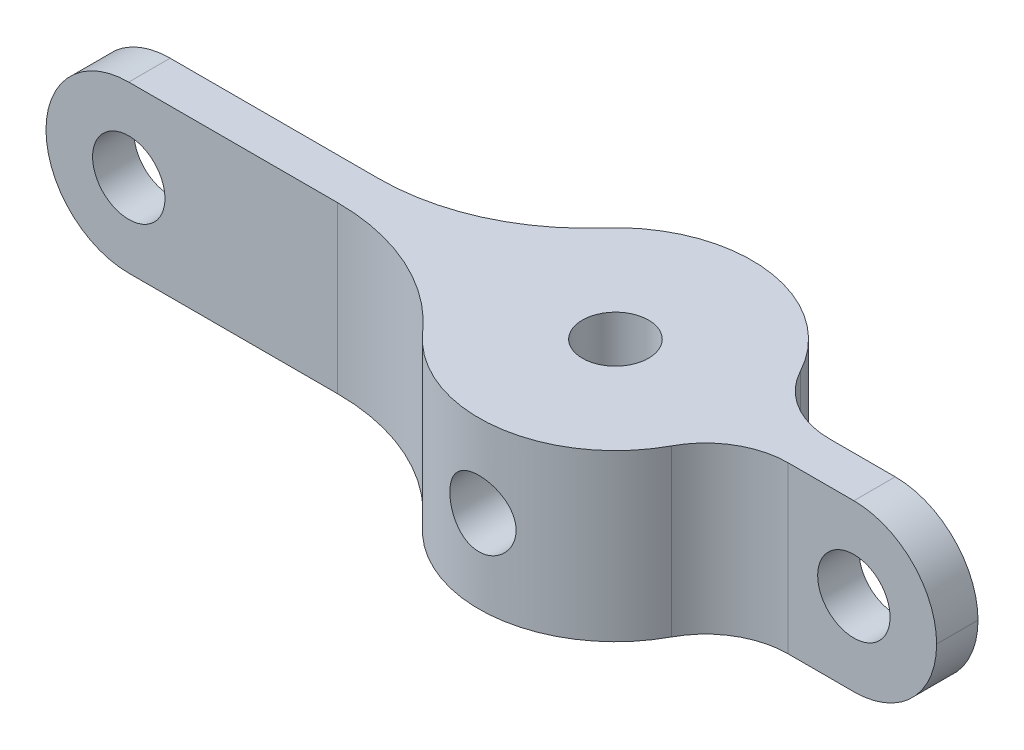
ISO-10303-21;
HEADER;
FILE_DESCRIPTION(('STEP AP214'),'2;1');
FILE_NAME('part.step','',(''),(''),'','','');
FILE_SCHEMA(('AUTOMOTIVE_DESIGN { 1 0 10303 214 1 1 1 1 }'));
ENDSEC;
DATA;
#1=APPLICATION_CONTEXT('core data for automotive mechanical design processes');
#2=APPLICATION_PROTOCOL_DEFINITION('international standard','automotive_design',2000,#1);
#3=PRODUCT_CONTEXT('',#1,'mechanical');
#4=PRODUCT('Part','Part','',(#3));
#5=PRODUCT_RELATED_PRODUCT_CATEGORY('part','',(#4));
#6=PRODUCT_DEFINITION_FORMATION('','',#4);
#7=PRODUCT_DEFINITION_CONTEXT('part definition',#1,'design');
#8=PRODUCT_DEFINITION('design','',#6,#7);
#9=PRODUCT_DEFINITION_SHAPE('','',#8);
#10=(LENGTH_UNIT() NAMED_UNIT(*) SI_UNIT(.MILLI.,.METRE.));
#11=(NAMED_UNIT(*) PLANE_ANGLE_UNIT() SI_UNIT($,.RADIAN.));
#12=(NAMED_UNIT(*) SI_UNIT($,.STERADIAN.) SOLID_ANGLE_UNIT());
#13=UNCERTAINTY_MEASURE_WITH_UNIT(LENGTH_MEASURE(1.E-05),#10,'distance_accuracy_value','');
#14=(GEOMETRIC_REPRESENTATION_CONTEXT(3) GLOBAL_UNCERTAINTY_ASSIGNED_CONTEXT((#13)) GLOBAL_UNIT_ASSIGNED_CONTEXT((#10,
#11,#12)) REPRESENTATION_CONTEXT('',''));
#15=CARTESIAN_POINT('',(0.,0.,0.));
#16=DIRECTION('',(0.,0.,1.));
#17=DIRECTION('',(1.,0.,0.));
#18=AXIS2_PLACEMENT_3D('',#15,#16,#17);
#19=CARTESIAN_POINT('',(0.,8.,-0.999999999999998));
#20=DIRECTION('',(0.,0.,-1.));
#21=DIRECTION('',(-1.,0.,0.));
#22=AXIS2_PLACEMENT_3D('',#19,#20,#21);
#23=PLANE('',#22);
#24=CARTESIAN_POINT('',(-22.52380257212,4.,-0.999999999999998));
#25=DIRECTION('',(0.,0.,-1.));
#26=DIRECTION('',(-1.,0.,0.));
#27=AXIS2_PLACEMENT_3D('',#24,#25,#26);
#28=CIRCLE('',#27,1.75);
#29=CARTESIAN_POINT('',(-24.27380257212,4.,-0.999999999999998));
#30=VERTEX_POINT('',#29);
#31=EDGE_CURVE('E289',#30,#30,#28,.T.);
#32=ORIENTED_EDGE('',*,*,#31,.F.);
#33=EDGE_LOOP('',(#32));
#34=FACE_BOUND('',#33,.T.);
#35=DIRECTION('',(1.,0.,0.));
#36=VECTOR('',#35,1.);
#37=CARTESIAN_POINT('',(0.,8.,-0.999999999999998));
#38=LINE('',#37,#36);
#39=CARTESIAN_POINT('',(-22.52380257212,8.,-0.999999999999998));
#40=VERTEX_POINT('',#39);
#41=CARTESIAN_POINT('',(-12.432216214336,8.,-0.999999999999998));
#42=VERTEX_POINT('',#41);
#43=EDGE_CURVE('E199',#40,#42,#38,.T.);
#44=ORIENTED_EDGE('',*,*,#43,.T.);
#45=DIRECTION('',(0.,-1.,0.));
#46=VECTOR('',#45,1.);
#47=CARTESIAN_POINT('',(-12.432216214336,8.,-0.999999999999998));
#48=LINE('',#47,#46);
#49=CARTESIAN_POINT('',(-12.432216214336,0.,-0.999999999999998));
#50=VERTEX_POINT('',#49);
#51=EDGE_CURVE('E278',#42,#50,#48,.T.);
#52=ORIENTED_EDGE('',*,*,#51,.T.);
#53=DIRECTION('',(1.,0.,0.));
#54=VECTOR('',#53,1.);
#55=CARTESIAN_POINT('',(0.,0.,-0.999999999999998));
#56=LINE('',#55,#54);
#57=CARTESIAN_POINT('',(-22.52380257212,0.,-0.999999999999998));
#58=VERTEX_POINT('',#57);
#59=EDGE_CURVE('E202',#58,#50,#56,.T.);
#60=ORIENTED_EDGE('',*,*,#59,.F.);
#61=CARTESIAN_POINT('',(-22.52380257212,4.,-0.999999999999998));
#62=DIRECTION('',(0.,0.,-1.));
#63=DIRECTION('',(-1.,0.,0.));
#64=AXIS2_PLACEMENT_3D('',#61,#62,#63);
#65=CIRCLE('',#64,4.);
#66=EDGE_CURVE('E195',#58,#40,#65,.T.);
#67=ORIENTED_EDGE('',*,*,#66,.T.);
#68=EDGE_LOOP('',(#44,#52,#60,#67));
#69=FACE_BOUND('',#68,.T.);
#70=ADVANCED_FACE('F93',(#34,#69),#23,.T.);
#71=CARTESIAN_POINT('',(0.,8.,0.999999999999999));
#72=DIRECTION('',(0.,0.,-1.));
#73=DIRECTION('',(-1.,0.,0.));
#74=AXIS2_PLACEMENT_3D('',#71,#72,#73);
#75=PLANE('',#74);
#76=CARTESIAN_POINT('',(-22.52380257212,4.,1.));
#77=DIRECTION('',(0.,0.,-1.));
#78=DIRECTION('',(-1.,0.,0.));
#79=AXIS2_PLACEMENT_3D('',#76,#77,#78);
#80=CIRCLE('',#79,1.75);
#81=CARTESIAN_POINT('',(-24.27380257212,4.,1.));
#82=VERTEX_POINT('',#81);
#83=EDGE_CURVE('E285',#82,#82,#80,.T.);
#84=ORIENTED_EDGE('',*,*,#83,.T.);
#85=EDGE_LOOP('',(#84));
#86=FACE_BOUND('',#85,.T.);
#87=DIRECTION('',(1.,0.,0.));
#88=VECTOR('',#87,1.);
#89=CARTESIAN_POINT('',(0.,0.,0.999999999999999));
#90=LINE('',#89,#88);
#91=CARTESIAN_POINT('',(-22.52380257212,0.,1.));
#92=VERTEX_POINT('',#91);
#93=CARTESIAN_POINT('',(-12.432216214336,0.,1.));
#94=VERTEX_POINT('',#93);
#95=EDGE_CURVE('E251',#92,#94,#90,.T.);
#96=ORIENTED_EDGE('',*,*,#95,.T.);
#97=DIRECTION('',(0.,1.,0.));
#98=VECTOR('',#97,1.);
#99=CARTESIAN_POINT('',(-12.432216214336,8.,1.));
#100=LINE('',#99,#98);
#101=CARTESIAN_POINT('',(-12.432216214336,8.,1.));
#102=VERTEX_POINT('',#101);
#103=EDGE_CURVE('E300',#94,#102,#100,.T.);
#104=ORIENTED_EDGE('',*,*,#103,.T.);
#105=DIRECTION('',(1.,0.,0.));
#106=VECTOR('',#105,1.);
#107=CARTESIAN_POINT('',(0.,8.,0.999999999999999));
#108=LINE('',#107,#106);
#109=CARTESIAN_POINT('',(-22.52380257212,8.,1.));
#110=VERTEX_POINT('',#109);
#111=EDGE_CURVE('E224',#110,#102,#108,.T.);
#112=ORIENTED_EDGE('',*,*,#111,.F.);
#113=CARTESIAN_POINT('',(-22.52380257212,4.,1.));
#114=DIRECTION('',(0.,0.,-1.));
#115=DIRECTION('',(-1.,0.,0.));
#116=AXIS2_PLACEMENT_3D('',#113,#114,#115);
#117=CIRCLE('',#116,4.);
#118=EDGE_CURVE('E207',#92,#110,#117,.T.);
#119=ORIENTED_EDGE('',*,*,#118,.F.);
#120=EDGE_LOOP('',(#96,#104,#112,#119));
#121=FACE_BOUND('',#120,.T.);
#122=ADVANCED_FACE('F398',(#86,#121),#75,.F.);
#123=CARTESIAN_POINT('',(0.,8.,0.));
#124=DIRECTION('',(0.,-1.,0.));
#125=DIRECTION('',(0.,0.,-1.));
#126=AXIS2_PLACEMENT_3D('',#123,#124,#125);
#127=CYLINDRICAL_SURFACE('',#126,1.6);
#128=CARTESIAN_POINT('',(0.,4.,0.));
#129=DIRECTION('',(0.,-0.707106781186547,0.707106781186547));
#130=DIRECTION('',(0.,-0.707106781186547,-0.707106781186547));
#131=AXIS2_PLACEMENT_3D('',#128,#129,#130);
#132=ELLIPSE('',#131,2.26274169979695,1.6);
#133=CARTESIAN_POINT('',(-1.6,4.,0.));
#134=VERTEX_POINT('',#133);
#135=CARTESIAN_POINT('',(1.6,4.,0.));
#136=VERTEX_POINT('',#135);
#137=EDGE_CURVE('E274',#134,#136,#132,.F.);
#138=ORIENTED_EDGE('',*,*,#137,.F.);
#139=CARTESIAN_POINT('',(0.,4.,0.));
#140=DIRECTION('',(0.,-0.707106781186547,-0.707106781186547));
#141=DIRECTION('',(0.,-0.707106781186547,0.707106781186547));
#142=AXIS2_PLACEMENT_3D('',#139,#140,#141);
#143=ELLIPSE('',#142,2.26274169979695,1.6);
#144=EDGE_CURVE('E217',#136,#134,#143,.F.);
#145=ORIENTED_EDGE('',*,*,#144,.F.);
#146=EDGE_LOOP('',(#138,#145));
#147=FACE_BOUND('',#146,.T.);
#148=CARTESIAN_POINT('',(0.,8.,0.));
#149=DIRECTION('',(0.,1.,0.));
#150=DIRECTION('',(0.,0.,1.));
#151=AXIS2_PLACEMENT_3D('',#148,#149,#150);
#152=CIRCLE('',#151,1.6);
#153=CARTESIAN_POINT('',(0.,8.,1.6));
#154=VERTEX_POINT('',#153);
#155=EDGE_CURVE('E261',#154,#154,#152,.T.);
#156=ORIENTED_EDGE('',*,*,#155,.T.);
#157=EDGE_LOOP('',(#156));
#158=FACE_BOUND('',#157,.T.);
#159=ADVANCED_FACE('F427',(#147,#158),#127,.F.);
#160=CARTESIAN_POINT('',(0.,8.,0.));
#161=DIRECTION('',(0.,1.,0.));
#162=DIRECTION('',(0.,0.,1.));
#163=AXIS2_PLACEMENT_3D('',#160,#161,#162);
#164=PLANE('',#163);
#165=ORIENTED_EDGE('',*,*,#155,.F.);
#166=EDGE_LOOP('',(#165));
#167=FACE_BOUND('',#166,.T.);
#168=CARTESIAN_POINT('',(0.,8.,0.));
#169=DIRECTION('',(0.,1.,0.));
#170=DIRECTION('',(0.,0.,1.));
#171=AXIS2_PLACEMENT_3D('',#168,#169,#170);
#172=CIRCLE('',#171,6.6);
#173=CARTESIAN_POINT('',(-4.94292933822999,8.,4.37349397590361));
#174=VERTEX_POINT('',#173);
#175=CARTESIAN_POINT('',(5.81961672004651,8.,3.11320754716981));
#176=VERTEX_POINT('',#175);
#177=EDGE_CURVE('E229',#174,#176,#172,.T.);
#178=ORIENTED_EDGE('',*,*,#177,.T.);
#179=CARTESIAN_POINT('',(9.34665715643834,8.,5.));
#180=DIRECTION('',(0.,1.,0.));
#181=DIRECTION('',(0.,0.,1.));
#182=AXIS2_PLACEMENT_3D('',#179,#180,#181);
#183=CIRCLE('',#182,4.);
#184=CARTESIAN_POINT('',(9.34665715643834,8.,1.));
#185=VERTEX_POINT('',#184);
#186=EDGE_CURVE('E12',#176,#185,#183,.F.);
#187=ORIENTED_EDGE('',*,*,#186,.T.);
#188=DIRECTION('',(1.,0.,0.));
#189=VECTOR('',#188,1.);
#190=CARTESIAN_POINT('',(0.,8.,1.));
#191=LINE('',#190,#189);
#192=CARTESIAN_POINT('',(12.52380257212,8.,1.));
#193=VERTEX_POINT('',#192);
#194=EDGE_CURVE('E237',#185,#193,#191,.T.);
#195=ORIENTED_EDGE('',*,*,#194,.T.);
#196=DIRECTION('',(0.,0.,1.));
#197=VECTOR('',#196,1.);
#198=CARTESIAN_POINT('',(12.52380257212,8.,0.));
#199=LINE('',#198,#197);
#200=CARTESIAN_POINT('',(12.52380257212,8.,-1.));
#201=VERTEX_POINT('',#200);
#202=EDGE_CURVE('E333',#193,#201,#199,.F.);
#203=ORIENTED_EDGE('',*,*,#202,.T.);
#204=DIRECTION('',(1.,0.,0.));
#205=VECTOR('',#204,1.);
#206=CARTESIAN_POINT('',(0.,8.,-1.));
#207=LINE('',#206,#205);
#208=CARTESIAN_POINT('',(9.34665715643834,8.,-1.));
#209=VERTEX_POINT('',#208);
#210=EDGE_CURVE('E231',#209,#201,#207,.T.);
#211=ORIENTED_EDGE('',*,*,#210,.F.);
#212=CARTESIAN_POINT('',(9.34665715643834,8.,-5.));
#213=DIRECTION('',(0.,1.,0.));
#214=DIRECTION('',(0.,0.,1.));
#215=AXIS2_PLACEMENT_3D('',#212,#213,#214);
#216=CIRCLE('',#215,4.);
#217=CARTESIAN_POINT('',(5.81961672004651,8.,-3.11320754716981));
#218=VERTEX_POINT('',#217);
#219=EDGE_CURVE('E358',#209,#218,#216,.F.);
#220=ORIENTED_EDGE('',*,*,#219,.T.);
#221=CARTESIAN_POINT('',(0.,8.,0.));
#222=DIRECTION('',(0.,1.,0.));
#223=DIRECTION('',(0.,0.,1.));
#224=AXIS2_PLACEMENT_3D('',#221,#222,#223);
#225=CIRCLE('',#224,6.6);
#226=CARTESIAN_POINT('',(-4.94292933822999,8.,-4.37349397590361));
#227=VERTEX_POINT('',#226);
#228=EDGE_CURVE('E225',#218,#227,#225,.T.);
#229=ORIENTED_EDGE('',*,*,#228,.T.);
#230=CARTESIAN_POINT('',(-12.432216214336,8.,-11.));
#231=DIRECTION('',(0.,1.,0.));
#232=DIRECTION('',(0.,0.,1.));
#233=AXIS2_PLACEMENT_3D('',#230,#231,#232);
#234=CIRCLE('',#233,10.);
#235=EDGE_CURVE('E222',#227,#42,#234,.F.);
#236=ORIENTED_EDGE('',*,*,#235,.T.);
#237=ORIENTED_EDGE('',*,*,#43,.F.);
#238=DIRECTION('',(0.,0.,1.));
#239=VECTOR('',#238,1.);
#240=CARTESIAN_POINT('',(-22.52380257212,8.,-6.6));
#241=LINE('',#240,#239);
#242=EDGE_CURVE('E210',#40,#110,#241,.T.);
#243=ORIENTED_EDGE('',*,*,#242,.T.);
#244=ORIENTED_EDGE('',*,*,#111,.T.);
#245=CARTESIAN_POINT('',(-12.432216214336,8.,11.));
#246=DIRECTION('',(0.,1.,0.));
#247=DIRECTION('',(0.,0.,1.));
#248=AXIS2_PLACEMENT_3D('',#245,#246,#247);
#249=CIRCLE('',#248,10.);
#250=EDGE_CURVE('E312',#102,#174,#249,.F.);
#251=ORIENTED_EDGE('',*,*,#250,.T.);
#252=EDGE_LOOP('',(#178,#187,#195,#203,#211,#220,#229,#236,#237,#243,#244,#251));
#253=FACE_BOUND('',#252,.T.);
#254=ADVANCED_FACE('F220',(#167,#253),#164,.T.);
#255=CARTESIAN_POINT('',(0.,0.,0.));
#256=DIRECTION('',(0.,1.,0.));
#257=DIRECTION('',(0.,0.,1.));
#258=AXIS2_PLACEMENT_3D('',#255,#256,#257);
#259=PLANE('',#258);
#260=CARTESIAN_POINT('',(0.,0.,0.));
#261=DIRECTION('',(0.,1.,0.));
#262=DIRECTION('',(0.,0.,1.));
#263=AXIS2_PLACEMENT_3D('',#260,#261,#262);
#264=CIRCLE('',#263,1.6);
#265=CARTESIAN_POINT('',(0.,0.,1.6));
#266=VERTEX_POINT('',#265);
#267=EDGE_CURVE('E206',#266,#266,#264,.T.);
#268=ORIENTED_EDGE('',*,*,#267,.T.);
#269=EDGE_LOOP('',(#268));
#270=FACE_BOUND('',#269,.T.);
#271=CARTESIAN_POINT('',(0.,0.,0.));
#272=DIRECTION('',(0.,1.,0.));
#273=DIRECTION('',(0.,0.,1.));
#274=AXIS2_PLACEMENT_3D('',#271,#272,#273);
#275=CIRCLE('',#274,6.6);
#276=CARTESIAN_POINT('',(5.81961672004651,0.,-3.11320754716981));
#277=VERTEX_POINT('',#276);
#278=CARTESIAN_POINT('',(-4.94292933822999,0.,-4.37349397590361));
#279=VERTEX_POINT('',#278);
#280=EDGE_CURVE('E246',#277,#279,#275,.T.);
#281=ORIENTED_EDGE('',*,*,#280,.F.);
#282=CARTESIAN_POINT('',(9.34665715643834,0.,-5.));
#283=DIRECTION('',(0.,1.,0.));
#284=DIRECTION('',(0.,0.,1.));
#285=AXIS2_PLACEMENT_3D('',#282,#283,#284);
#286=CIRCLE('',#285,4.);
#287=CARTESIAN_POINT('',(9.34665715643834,0.,-1.));
#288=VERTEX_POINT('',#287);
#289=EDGE_CURVE('E355',#277,#288,#286,.T.);
#290=ORIENTED_EDGE('',*,*,#289,.T.);
#291=DIRECTION('',(1.,0.,0.));
#292=VECTOR('',#291,1.);
#293=CARTESIAN_POINT('',(0.,0.,-1.));
#294=LINE('',#293,#292);
#295=CARTESIAN_POINT('',(12.52380257212,0.,-1.));
#296=VERTEX_POINT('',#295);
#297=EDGE_CURVE('E243',#288,#296,#294,.T.);
#298=ORIENTED_EDGE('',*,*,#297,.T.);
#299=DIRECTION('',(0.,0.,1.));
#300=VECTOR('',#299,1.);
#301=CARTESIAN_POINT('',(12.52380257212,0.,1.));
#302=LINE('',#301,#300);
#303=CARTESIAN_POINT('',(12.52380257212,0.,1.));
#304=VERTEX_POINT('',#303);
#305=EDGE_CURVE('E315',#296,#304,#302,.T.);
#306=ORIENTED_EDGE('',*,*,#305,.T.);
#307=DIRECTION('',(1.,0.,0.));
#308=VECTOR('',#307,1.);
#309=CARTESIAN_POINT('',(0.,0.,1.));
#310=LINE('',#309,#308);
#311=CARTESIAN_POINT('',(9.34665715643834,0.,1.));
#312=VERTEX_POINT('',#311);
#313=EDGE_CURVE('E258',#312,#304,#310,.T.);
#314=ORIENTED_EDGE('',*,*,#313,.F.);
#315=CARTESIAN_POINT('',(9.34665715643834,0.,5.));
#316=DIRECTION('',(0.,1.,0.));
#317=DIRECTION('',(0.,0.,1.));
#318=AXIS2_PLACEMENT_3D('',#315,#316,#317);
#319=CIRCLE('',#318,4.);
#320=CARTESIAN_POINT('',(5.81961672004651,0.,3.11320754716981));
#321=VERTEX_POINT('',#320);
#322=EDGE_CURVE('E102',#312,#321,#319,.T.);
#323=ORIENTED_EDGE('',*,*,#322,.T.);
#324=CARTESIAN_POINT('',(0.,0.,0.));
#325=DIRECTION('',(0.,1.,0.));
#326=DIRECTION('',(0.,0.,1.));
#327=AXIS2_PLACEMENT_3D('',#324,#325,#326);
#328=CIRCLE('',#327,6.6);
#329=CARTESIAN_POINT('',(-4.94292933822999,0.,4.37349397590361));
#330=VERTEX_POINT('',#329);
#331=EDGE_CURVE('E255',#330,#321,#328,.T.);
#332=ORIENTED_EDGE('',*,*,#331,.F.);
#333=CARTESIAN_POINT('',(-12.432216214336,0.,11.));
#334=DIRECTION('',(0.,1.,0.));
#335=DIRECTION('',(0.,0.,1.));
#336=AXIS2_PLACEMENT_3D('',#333,#334,#335);
#337=CIRCLE('',#336,10.);
#338=EDGE_CURVE('E309',#330,#94,#337,.T.);
#339=ORIENTED_EDGE('',*,*,#338,.T.);
#340=ORIENTED_EDGE('',*,*,#95,.F.);
#341=DIRECTION('',(0.,0.,1.));
#342=VECTOR('',#341,1.);
#343=CARTESIAN_POINT('',(-22.52380257212,0.,-6.6));
#344=LINE('',#343,#342);
#345=EDGE_CURVE('E218',#58,#92,#344,.T.);
#346=ORIENTED_EDGE('',*,*,#345,.F.);
#347=ORIENTED_EDGE('',*,*,#59,.T.);
#348=CARTESIAN_POINT('',(-12.432216214336,0.,-11.));
#349=DIRECTION('',(0.,1.,0.));
#350=DIRECTION('',(0.,0.,1.));
#351=AXIS2_PLACEMENT_3D('',#348,#349,#350);
#352=CIRCLE('',#351,10.);
#353=EDGE_CURVE('E303',#50,#279,#352,.T.);
#354=ORIENTED_EDGE('',*,*,#353,.T.);
#355=EDGE_LOOP('',(#281,#290,#298,#306,#314,#323,#332,#339,#340,#346,#347,#354));
#356=FACE_BOUND('',#355,.T.);
#357=ADVANCED_FACE('F373',(#270,#356),#259,.F.);
#358=CARTESIAN_POINT('',(0.,8.,-1.));
#359=DIRECTION('',(0.,0.,-1.));
#360=DIRECTION('',(-1.,0.,0.));
#361=AXIS2_PLACEMENT_3D('',#358,#359,#360);
#362=PLANE('',#361);
#363=CARTESIAN_POINT('',(12.52380257212,4.,-1.));
#364=DIRECTION('',(0.,0.,-1.));
#365=DIRECTION('',(-1.,0.,0.));
#366=AXIS2_PLACEMENT_3D('',#363,#364,#365);
#367=CIRCLE('',#366,1.75);
#368=CARTESIAN_POINT('',(10.77380257212,4.,-1.));
#369=VERTEX_POINT('',#368);
#370=EDGE_CURVE('E283',#369,#369,#367,.T.);
#371=ORIENTED_EDGE('',*,*,#370,.F.);
#372=EDGE_LOOP('',(#371));
#373=FACE_BOUND('',#372,.T.);
#374=ORIENTED_EDGE('',*,*,#297,.F.);
#375=DIRECTION('',(0.,-1.,0.));
#376=VECTOR('',#375,1.);
#377=CARTESIAN_POINT('',(9.34665715643834,8.,-1.));
#378=LINE('',#377,#376);
#379=EDGE_CURVE('E346',#288,#209,#378,.F.);
#380=ORIENTED_EDGE('',*,*,#379,.T.);
#381=ORIENTED_EDGE('',*,*,#210,.T.);
#382=CARTESIAN_POINT('',(12.52380257212,4.,-1.));
#383=DIRECTION('',(0.,0.,-1.));
#384=DIRECTION('',(-1.,0.,0.));
#385=AXIS2_PLACEMENT_3D('',#382,#383,#384);
#386=CIRCLE('',#385,4.);
#387=CARTESIAN_POINT('',(16.52380257212,4.,-1.));
#388=VERTEX_POINT('',#387);
#389=EDGE_CURVE('E326',#201,#388,#386,.T.);
#390=ORIENTED_EDGE('',*,*,#389,.T.);
#391=CARTESIAN_POINT('',(12.52380257212,4.,-1.));
#392=DIRECTION('',(0.,0.,-1.));
#393=DIRECTION('',(-1.,0.,0.));
#394=AXIS2_PLACEMENT_3D('',#391,#392,#393);
#395=CIRCLE('',#394,4.);
#396=EDGE_CURVE('E329',#388,#296,#395,.T.);
#397=ORIENTED_EDGE('',*,*,#396,.T.);
#398=EDGE_LOOP('',(#374,#380,#381,#390,#397));
#399=FACE_BOUND('',#398,.T.);
#400=ADVANCED_FACE('F375',(#373,#399),#362,.T.);
#401=CARTESIAN_POINT('',(0.,8.,0.));
#402=DIRECTION('',(0.,-1.,0.));
#403=DIRECTION('',(0.,0.,-1.));
#404=AXIS2_PLACEMENT_3D('',#401,#402,#403);
#405=CYLINDRICAL_SURFACE('',#404,6.6);
#406=CARTESIAN_POINT('',(0.,2.4,-6.6));
#407=CARTESIAN_POINT('',(0.0884871047804324,2.40000263347105,-6.59999845237628));
#408=CARTESIAN_POINT('',(0.177004197535391,2.40736531672387,-6.59820264088588));
#409=CARTESIAN_POINT('',(0.351507185866568,2.43658086125863,-6.59121265079195));
#410=CARTESIAN_POINT('',(0.437491519399154,2.4584424769067,-6.58601641906082));
#411=CARTESIAN_POINT('',(0.604383322898158,2.51591761983053,-6.57280179586116));
#412=CARTESIAN_POINT('',(0.685296564555969,2.55151517048025,-6.56478668406154));
#413=CARTESIAN_POINT('',(0.840002097330867,2.63539684793011,-6.54679079512535));
#414=CARTESIAN_POINT('',(0.913794253248526,2.6836812155347,-6.53680998067929));
#415=CARTESIAN_POINT('',(1.05359898158629,2.79255845605668,-6.51575166755063));
#416=CARTESIAN_POINT('',(1.1194532748408,2.85335146665495,-6.50465806689777));
#417=CARTESIAN_POINT('',(1.24013805469451,2.98509151169911,-6.4827330784308));
#418=CARTESIAN_POINT('',(1.29496736736913,3.05603962607091,-6.47190171864763));
#419=CARTESIAN_POINT('',(1.3927784322573,3.20728999715424,-6.45156620707035));
#420=CARTESIAN_POINT('',(1.43558530257519,3.28770835164884,-6.44208254836976));
#421=CARTESIAN_POINT('',(1.50701245726918,3.45486633259151,-6.42575015314717));
#422=CARTESIAN_POINT('',(1.53563486171202,3.54160501215433,-6.41890102289234));
#423=CARTESIAN_POINT('',(1.57734489371298,3.71720673912327,-6.40877830876022));
#424=CARTESIAN_POINT('',(1.59071603871777,3.80599860181078,-6.40543956279832));
#425=CARTESIAN_POINT('',(1.60242673261882,3.98462316956431,-6.40252043401273));
#426=CARTESIAN_POINT('',(1.60076857254204,4.07445571390658,-6.40293947836145));
#427=CARTESIAN_POINT('',(1.58269442365619,4.25045558963716,-6.40742990104572));
#428=CARTESIAN_POINT('',(1.56661407754694,4.3366598375025,-6.41141820854809));
#429=CARTESIAN_POINT('',(1.52068651080122,4.50510917915287,-6.42246565768836));
#430=CARTESIAN_POINT('',(1.49083836176634,4.58735400553083,-6.42952500641264));
#431=CARTESIAN_POINT('',(1.41793089019718,4.74646088223213,-6.44599678588988));
#432=CARTESIAN_POINT('',(1.37474793202052,4.82326392093305,-6.45543107829042));
#433=CARTESIAN_POINT('',(1.27648322411144,4.96865498282184,-6.47557713287736));
#434=CARTESIAN_POINT('',(1.22139950733329,5.03724164502926,-6.48628910611708));
#435=CARTESIAN_POINT('',(1.09914861395708,5.1661788413458,-6.50813503054095));
#436=CARTESIAN_POINT('',(1.03169762528033,5.22625998701724,-6.51927260462533));
#437=CARTESIAN_POINT('',(0.887545581000936,5.33430743352589,-6.54045578138131));
#438=CARTESIAN_POINT('',(0.810844275125097,5.38227340647072,-6.55050135449415));
#439=CARTESIAN_POINT('',(0.649998656510989,5.46481949575633,-6.56841391844984));
#440=CARTESIAN_POINT('',(0.565832188556601,5.49935801032778,-6.57627411734107));
#441=CARTESIAN_POINT('',(0.392655451948536,5.5537226378455,-6.5888807031732));
#442=CARTESIAN_POINT('',(0.303646056102783,5.57355139246665,-6.59362764919464));
#443=CARTESIAN_POINT('',(0.125615213956867,5.59752721528939,-6.59939093911524));
#444=CARTESIAN_POINT('',(0.0366459651472652,5.60204141179786,-6.60049460381098));
#445=CARTESIAN_POINT('',(-0.140776258477429,5.59626390230624,-6.59909466564288));
#446=CARTESIAN_POINT('',(-0.229229276187588,5.58597344457197,-6.59659136690289));
#447=CARTESIAN_POINT('',(-0.401847472163781,5.55118188716229,-6.58831452552343));
#448=CARTESIAN_POINT('',(-0.486055011102015,5.52687911710313,-6.58258664957881));
#449=CARTESIAN_POINT('',(-0.649195064214534,5.46497770883312,-6.56850483626002));
#450=CARTESIAN_POINT('',(-0.728127063859327,5.42737777597789,-6.56015064318998));
#451=CARTESIAN_POINT('',(-0.879950806200764,5.3392244257697,-6.54153197452893));
#452=CARTESIAN_POINT('',(-0.952717917401711,5.28846282353834,-6.53123759982389));
#453=CARTESIAN_POINT('',(-1.08883184939668,5.17569515647506,-6.50993085065674));
#454=CARTESIAN_POINT('',(-1.1521771437782,5.11368727325592,-6.49891836026872));
#455=CARTESIAN_POINT('',(-1.26914694432883,4.97848712284871,-6.47710536928048));
#456=CARTESIAN_POINT('',(-1.32251467418107,4.9050706224655,-6.46631555234309));
#457=CARTESIAN_POINT('',(-1.41616976585029,4.7501053615509,-6.44645361396241));
#458=CARTESIAN_POINT('',(-1.45645771308602,4.66855696519668,-6.43738141565033));
#459=CARTESIAN_POINT('',(-1.52251418716929,4.50008615147245,-6.42207916268185));
#460=CARTESIAN_POINT('',(-1.54836854571394,4.41319898890759,-6.41583234952641));
#461=CARTESIAN_POINT('',(-1.58505789716451,4.23613815662034,-6.4068677856975));
#462=CARTESIAN_POINT('',(-1.59589594307811,4.14596515877746,-6.40414931767361));
#463=CARTESIAN_POINT('',(-1.60209276546078,3.96749882500255,-6.40260157114372));
#464=CARTESIAN_POINT('',(-1.59786103801777,3.87922036539015,-6.40366940278577));
#465=CARTESIAN_POINT('',(-1.57497012054624,3.70467575423379,-6.40933736632074));
#466=CARTESIAN_POINT('',(-1.55631118769791,3.61840956684718,-6.41393743524778));
#467=CARTESIAN_POINT('',(-1.50531289529928,3.4507530868248,-6.4260959785972));
#468=CARTESIAN_POINT('',(-1.47304599413336,3.36933953859638,-6.43363876819741));
#469=CARTESIAN_POINT('',(-1.39580584338769,3.213025411398,-6.45083596460501));
#470=CARTESIAN_POINT('',(-1.35083093760038,3.13812568302559,-6.46049064661382));
#471=CARTESIAN_POINT('',(-1.2481488796257,2.99497622503882,-6.48112073517946));
#472=CARTESIAN_POINT('',(-1.19015559411356,2.926935546408,-6.4921227999521));
#473=CARTESIAN_POINT('',(-1.06364636293858,2.80141819174674,-6.51404407329312));
#474=CARTESIAN_POINT('',(-0.995127943347053,2.74394400636199,-6.52496326174657));
#475=CARTESIAN_POINT('',(-0.848128515932999,2.64025633509036,-6.54570645812674));
#476=CARTESIAN_POINT('',(-0.769499868983518,2.59424757291752,-6.55550906027064));
#477=CARTESIAN_POINT('',(-0.605395913004769,2.51617432561577,-6.57269194474753));
#478=CARTESIAN_POINT('',(-0.519925783839181,2.48409940688694,-6.58007403852714));
#479=CARTESIAN_POINT('',(-0.362119204891194,2.43981172920245,-6.59043455500525));
#480=CARTESIAN_POINT('',(-0.290562704361759,2.4249136033353,-6.59399758857178));
#481=CARTESIAN_POINT('',(-0.146010878155246,2.40500698012747,-6.59878087190609));
#482=CARTESIAN_POINT('',(-0.0730156482152062,2.39999782697608,-6.6000012770307));
#483=CARTESIAN_POINT('',(0.,2.4,-6.6));
#484=B_SPLINE_CURVE_WITH_KNOTS('',3,(#406,#407,#408,#409,#410,#411,#412,#413,#414,#415,#416,
#417,#418,#419,#420,#421,#422,#423,#424,#425,#426,#427,#428,#429,#430,#431,#432,#433,#434,#435,
#436,#437,#438,#439,#440,#441,#442,#443,#444,#445,#446,#447,#448,#449,#450,#451,#452,#453,#454,
#455,#456,#457,#458,#459,#460,#461,#462,#463,#464,#465,#466,#467,#468,#469,#470,#471,#472,#473,
#474,#475,#476,#477,#478,#479,#480,#481,#482,#483),.UNSPECIFIED.,.T.,.F.,(4,2,2,2,2,2,2,2,2,2,2,
2,2,2,2,2,2,2,2,2,2,2,2,2,2,2,2,2,2,2,2,2,2,2,2,2,2,2,4),(0.,0.265193819479546,
0.530547907308908,0.795594280683041,1.06064568518191,1.33032365821082,1.6000303309865,
1.87347800354744,2.1468847931947,2.41512165252279,2.68331762323111,2.945429422782,
3.207558899791,3.47219567743014,3.73687622971053,4.0086368526527,4.28040482990111,
4.553008229715,4.8255626617685,5.09153527162428,5.35748545710906,5.61976070374928,
5.88206149318422,6.14879538840011,6.4155724497614,6.68847880607345,6.96137294608703,
7.2326265026243,7.50382490176047,7.76771083568067,8.03159206566325,8.29408560190011,
8.55661336415992,8.82560273051032,9.0946554197277,9.36821437209419,9.64156813016689,
9.86040886330486,10.0792350830124),.UNSPECIFIED.);
#485=CARTESIAN_POINT('',(0.,2.4,-6.6));
#486=VERTEX_POINT('',#485);
#487=EDGE_CURVE('E284',#486,#486,#484,.T.);
#488=ORIENTED_EDGE('',*,*,#487,.T.);
#489=EDGE_LOOP('',(#488));
#490=FACE_BOUND('',#489,.T.);
#491=ORIENTED_EDGE('',*,*,#228,.F.);
#492=DIRECTION('',(0.,-1.,0.));
#493=VECTOR('',#492,1.);
#494=CARTESIAN_POINT('',(5.81961672004651,8.,-3.11320754716981));
#495=LINE('',#494,#493);
#496=EDGE_CURVE('E337',#218,#277,#495,.T.);
#497=ORIENTED_EDGE('',*,*,#496,.T.);
#498=ORIENTED_EDGE('',*,*,#280,.T.);
#499=DIRECTION('',(0.,-1.,0.));
#500=VECTOR('',#499,1.);
#501=CARTESIAN_POINT('',(-4.94292933822999,8.,-4.37349397590361));
#502=LINE('',#501,#500);
#503=EDGE_CURVE('E292',#279,#227,#502,.F.);
#504=ORIENTED_EDGE('',*,*,#503,.T.);
#505=EDGE_LOOP('',(#491,#497,#498,#504));
#506=FACE_BOUND('',#505,.T.);
#507=ADVANCED_FACE('F368',(#490,#506),#405,.T.);
#508=CARTESIAN_POINT('',(0.,8.,0.));
#509=DIRECTION('',(0.,-1.,0.));
#510=DIRECTION('',(0.,0.,-1.));
#511=AXIS2_PLACEMENT_3D('',#508,#509,#510);
#512=CYLINDRICAL_SURFACE('',#511,6.6);
#513=CARTESIAN_POINT('',(1.6,4.,6.40312423743285));
#514=CARTESIAN_POINT('',(1.59999733947836,3.91155597593902,6.40312597037608));
#515=CARTESIAN_POINT('',(1.59264157848281,3.82308190399929,6.40497670400887));
#516=CARTESIAN_POINT('',(1.56345601743318,3.64866817845918,6.4121621325328));
#517=CARTESIAN_POINT('',(1.54161728105349,3.56273012385576,6.41749897840401));
#518=CARTESIAN_POINT('',(1.48420900234039,3.39593644485483,6.43101748536075));
#519=CARTESIAN_POINT('',(1.44865650524925,3.31507465551702,6.43919561368331));
#520=CARTESIAN_POINT('',(1.3648810998873,3.16045620913115,6.45747086045777));
#521=CARTESIAN_POINT('',(1.31665785249964,3.08669974232041,6.46756803026843));
#522=CARTESIAN_POINT('',(1.20784389900135,2.94685840397718,6.48877758318028));
#523=CARTESIAN_POINT('',(1.14703929913897,2.88094227544218,6.49990538881894));
#524=CARTESIAN_POINT('',(1.01524965153105,2.76013710402569,6.5217882988137));
#525=CARTESIAN_POINT('',(0.944263695721745,2.70524904577491,6.53254336981968));
#526=CARTESIAN_POINT('',(0.792976530006598,2.60737347603025,6.55263898037571));
#527=CARTESIAN_POINT('',(0.712565706009929,2.56455086285417,6.56195919706409));
#528=CARTESIAN_POINT('',(0.545423893058167,2.49309256978639,6.57795945463852));
#529=CARTESIAN_POINT('',(0.458693781262911,2.46445492521231,6.5846398611243));
#530=CARTESIAN_POINT('',(0.283133437030869,2.42271751649537,6.59449878121048));
#531=CARTESIAN_POINT('',(0.1943749563481,2.40933142763582,6.59774174354862));
#532=CARTESIAN_POINT('',(0.0158168750524329,2.39757925406181,6.60058464260181));
#533=CARTESIAN_POINT('',(-0.0739825787233731,2.39921107609803,6.60018508702391));
#534=CARTESIAN_POINT('',(-0.250090763222411,2.4172406113998,6.59583627033507));
#535=CARTESIAN_POINT('',(-0.336433231377964,2.43332938154768,6.59196128200833));
#536=CARTESIAN_POINT('',(-0.505154519829913,2.47932061283831,6.58118299179282));
#537=CARTESIAN_POINT('',(-0.587533136198654,2.50922378385116,6.57427953428333));
#538=CARTESIAN_POINT('',(-0.746813265295442,2.58225077090495,6.55810487467464));
#539=CARTESIAN_POINT('',(-0.823661440791101,2.62548633342579,6.54881377443151));
#540=CARTESIAN_POINT('',(-0.969121094903156,2.72386642851992,6.52887450690487));
#541=CARTESIAN_POINT('',(-1.03773121476807,2.77901292144713,6.51822611635086));
#542=CARTESIAN_POINT('',(-1.16660863727457,2.90131237037916,6.49641521034034));
#543=CARTESIAN_POINT('',(-1.22661882104947,2.96873544836762,6.48524650824044));
#544=CARTESIAN_POINT('',(-1.33453585965573,3.11280509115139,6.46390352969242));
#545=CARTESIAN_POINT('',(-1.38244221584308,3.18945203575236,6.45372929422414));
#546=CARTESIAN_POINT('',(-1.46494322915083,3.35027529726117,6.43550637883586));
#547=CARTESIAN_POINT('',(-1.4994794029305,3.43448275204052,6.42746708453676));
#548=CARTESIAN_POINT('',(-1.55382718977604,3.60774960784609,6.41454673226991));
#549=CARTESIAN_POINT('',(-1.57364174189015,3.69680803660343,6.40966504393782));
#550=CARTESIAN_POINT('',(-1.59756435294379,3.87487317062515,6.40374402358904));
#551=CARTESIAN_POINT('',(-1.60205110778769,3.96382597960497,6.40261207062851));
#552=CARTESIAN_POINT('',(-1.59622462099622,4.14120907595185,6.40406713975094));
#553=CARTESIAN_POINT('',(-1.58591265192973,4.22963940759109,6.4066538420601));
#554=CARTESIAN_POINT('',(-1.55111264233716,4.40208365987391,6.41516633208495));
#555=CARTESIAN_POINT('',(-1.52684202876438,4.48614422744036,6.42104086992378));
#556=CARTESIAN_POINT('',(-1.46505330245464,4.64900436527138,6.43541907577093));
#557=CARTESIAN_POINT('',(-1.427533693674,4.72780334021463,6.44392304067414));
#558=CARTESIAN_POINT('',(-1.33950890361332,4.87951675248159,6.46279907110407));
#559=CARTESIAN_POINT('',(-1.28877556385843,4.95229477484203,6.47320288866304));
#560=CARTESIAN_POINT('',(-1.176054449739,5.08844357310027,6.49462703788132));
#561=CARTESIAN_POINT('',(-1.11406494115952,5.15181289668069,6.50564746435902));
#562=CARTESIAN_POINT('',(-0.978859243852804,5.2688631518392,6.52737484171816));
#563=CARTESIAN_POINT('',(-0.905414542587483,5.3222830545524,6.5380684476914));
#564=CARTESIAN_POINT('',(-0.750376177663216,5.41602976375486,6.55766967940658));
#565=CARTESIAN_POINT('',(-0.668782931491629,5.45635724057966,6.56657739657757));
#566=CARTESIAN_POINT('',(-0.500317828978863,5.52243510776645,6.58154809251216));
#567=CARTESIAN_POINT('',(-0.413487967421983,5.54828783958792,6.58763099011155));
#568=CARTESIAN_POINT('',(-0.236550277056996,5.58499323333175,6.59635362322054));
#569=CARTESIAN_POINT('',(-0.146443043735651,5.59584860638511,6.5989939810466));
#570=CARTESIAN_POINT('',(0.0320330834287484,5.60210629802376,6.60051038370048));
#571=CARTESIAN_POINT('',(0.120387845166777,5.5978949189643,6.59948053308083));
#572=CARTESIAN_POINT('',(0.295090603727328,5.57501819968965,6.59397912156365));
#573=CARTESIAN_POINT('',(0.381438653778093,5.55635324330889,6.58950765206303));
#574=CARTESIAN_POINT('',(0.549299070646441,5.50530112103433,6.57763810488231));
#575=CARTESIAN_POINT('',(0.630832598167394,5.47298003981504,6.57025413266408));
#576=CARTESIAN_POINT('',(0.787364816025321,5.39559383843108,6.55333973860274));
#577=CARTESIAN_POINT('',(0.862362725594603,5.35052719836026,6.54380906079289));
#578=CARTESIAN_POINT('',(1.00554031833552,5.24773032186349,6.52336129617945));
#579=CARTESIAN_POINT('',(1.07352623332948,5.18973548211022,6.51241761643753));
#580=CARTESIAN_POINT('',(1.19893242972994,5.06324734636399,6.49050250288316));
#581=CARTESIAN_POINT('',(1.25635006733463,4.99475143121456,6.47953106282008));
#582=CARTESIAN_POINT('',(1.35995880768537,4.84778221543341,6.45858815699281));
#583=CARTESIAN_POINT('',(1.40593901379458,4.76915709819361,6.448637221504));
#584=CARTESIAN_POINT('',(1.48395977964431,4.60506449235805,6.43113315660768));
#585=CARTESIAN_POINT('',(1.51601091235572,4.51960225208781,6.42357820968792));
#586=CARTESIAN_POINT('',(1.56024691692113,4.36185429396613,6.41295817096726));
#587=CARTESIAN_POINT('',(1.57512286070378,4.29035135897641,6.40929733413103));
#588=CARTESIAN_POINT('',(1.59500013121856,4.14590569392776,6.40437974225737));
#589=CARTESIAN_POINT('',(1.60000219483265,4.07296307172224,6.40312280781832));
#590=CARTESIAN_POINT('',(1.6,4.,6.40312423743285));
#591=B_SPLINE_CURVE_WITH_KNOTS('',3,(#513,#514,#515,#516,#517,#518,#519,#520,#521,#522,#523,
#524,#525,#526,#527,#528,#529,#530,#531,#532,#533,#534,#535,#536,#537,#538,#539,#540,#541,#542,
#543,#544,#545,#546,#547,#548,#549,#550,#551,#552,#553,#554,#555,#556,#557,#558,#559,#560,#561,
#562,#563,#564,#565,#566,#567,#568,#569,#570,#571,#572,#573,#574,#575,#576,#577,#578,#579,#580,
#581,#582,#583,#584,#585,#586,#587,#588,#589,#590),.UNSPECIFIED.,.T.,.F.,(4,2,2,2,2,2,2,2,2,2,2,
2,2,2,2,2,2,2,2,2,2,2,2,2,2,2,2,2,2,2,2,2,2,2,2,2,2,2,4),(0.,0.265064273258436,
0.530292249566571,0.795191622869192,1.0600980865956,1.32994540119492,1.59981679815771,
1.87321504847942,2.14657542130955,2.41471463941518,2.68281648389817,2.94532180998148,
3.20784062672676,3.47262248908861,3.73744796368044,4.00902119378665,4.28060561013037,
4.55336490852977,4.82606973818099,5.09198626575298,5.35787992805489,5.619739930883,
5.88162951175322,6.1483813618781,6.41517434484027,6.68820231251325,6.96121629887958,
7.23227478485269,7.50328426411234,7.76739558504667,8.03149989238554,8.29434052625654,
8.55721251706292,8.82606066778539,9.09497598347789,9.36853321512672,9.64188243681686,
9.86056704862862,10.0792353395176),.UNSPECIFIED.);
#592=CARTESIAN_POINT('',(1.6,4.,6.40312423743285));
#593=VERTEX_POINT('',#592);
#594=EDGE_CURVE('E342',#593,#593,#591,.T.);
#595=ORIENTED_EDGE('',*,*,#594,.T.);
#596=EDGE_LOOP('',(#595));
#597=FACE_BOUND('',#596,.T.);
#598=ORIENTED_EDGE('',*,*,#331,.T.);
#599=DIRECTION('',(0.,-1.,0.));
#600=VECTOR('',#599,1.);
#601=CARTESIAN_POINT('',(5.81961672004651,8.,3.11320754716981));
#602=LINE('',#601,#600);
#603=EDGE_CURVE('E115',#321,#176,#602,.F.);
#604=ORIENTED_EDGE('',*,*,#603,.T.);
#605=ORIENTED_EDGE('',*,*,#177,.F.);
#606=DIRECTION('',(0.,-1.,0.));
#607=VECTOR('',#606,1.);
#608=CARTESIAN_POINT('',(-4.94292933822999,8.,4.37349397590361));
#609=LINE('',#608,#607);
#610=EDGE_CURVE('E296',#174,#330,#609,.T.);
#611=ORIENTED_EDGE('',*,*,#610,.T.);
#612=EDGE_LOOP('',(#598,#604,#605,#611));
#613=FACE_BOUND('',#612,.T.);
#614=ADVANCED_FACE('F392',(#597,#613),#512,.T.);
#615=CARTESIAN_POINT('',(0.,8.,1.));
#616=DIRECTION('',(0.,0.,-1.));
#617=DIRECTION('',(-1.,0.,0.));
#618=AXIS2_PLACEMENT_3D('',#615,#616,#617);
#619=PLANE('',#618);
#620=CARTESIAN_POINT('',(12.52380257212,4.,1.));
#621=DIRECTION('',(0.,0.,-1.));
#622=DIRECTION('',(-1.,0.,0.));
#623=AXIS2_PLACEMENT_3D('',#620,#621,#622);
#624=CIRCLE('',#623,1.75);
#625=CARTESIAN_POINT('',(10.77380257212,4.,1.));
#626=VERTEX_POINT('',#625);
#627=EDGE_CURVE('E279',#626,#626,#624,.T.);
#628=ORIENTED_EDGE('',*,*,#627,.T.);
#629=EDGE_LOOP('',(#628));
#630=FACE_BOUND('',#629,.T.);
#631=ORIENTED_EDGE('',*,*,#194,.F.);
#632=DIRECTION('',(0.,1.,0.));
#633=VECTOR('',#632,1.);
#634=CARTESIAN_POINT('',(9.34665715643834,0.,1.));
#635=LINE('',#634,#633);
#636=EDGE_CURVE('E349',#185,#312,#635,.F.);
#637=ORIENTED_EDGE('',*,*,#636,.T.);
#638=ORIENTED_EDGE('',*,*,#313,.T.);
#639=CARTESIAN_POINT('',(12.52380257212,4.,1.));
#640=DIRECTION('',(0.,0.,-1.));
#641=DIRECTION('',(-1.,0.,0.));
#642=AXIS2_PLACEMENT_3D('',#639,#640,#641);
#643=CIRCLE('',#642,4.);
#644=CARTESIAN_POINT('',(16.52380257212,4.,1.));
#645=VERTEX_POINT('',#644);
#646=EDGE_CURVE('E323',#304,#645,#643,.F.);
#647=ORIENTED_EDGE('',*,*,#646,.T.);
#648=CARTESIAN_POINT('',(12.52380257212,4.,1.));
#649=DIRECTION('',(0.,0.,-1.));
#650=DIRECTION('',(-1.,0.,0.));
#651=AXIS2_PLACEMENT_3D('',#648,#649,#650);
#652=CIRCLE('',#651,4.);
#653=EDGE_CURVE('E319',#645,#193,#652,.F.);
#654=ORIENTED_EDGE('',*,*,#653,.T.);
#655=EDGE_LOOP('',(#631,#637,#638,#647,#654));
#656=FACE_BOUND('',#655,.T.);
#657=ADVANCED_FACE('F385',(#630,#656),#619,.F.);
#658=CARTESIAN_POINT('',(0.,4.,0.));
#659=DIRECTION('',(0.,-0.707106781186547,0.707106781186547));
#660=DIRECTION('',(0.,-0.707106781186547,-0.707106781186547));
#661=AXIS2_PLACEMENT_3D('',#658,#659,#660);
#662=ELLIPSE('',#661,2.26274169979695,1.6);
#663=EDGE_CURVE('E270',#134,#136,#662,.T.);
#664=ORIENTED_EDGE('',*,*,#663,.F.);
#665=CARTESIAN_POINT('',(0.,4.,0.));
#666=DIRECTION('',(0.,-0.707106781186547,-0.707106781186547));
#667=DIRECTION('',(0.,-0.707106781186547,0.707106781186547));
#668=AXIS2_PLACEMENT_3D('',#665,#666,#667);
#669=ELLIPSE('',#668,2.26274169979695,1.6);
#670=EDGE_CURVE('E267',#136,#134,#669,.T.);
#671=ORIENTED_EDGE('',*,*,#670,.F.);
#672=EDGE_LOOP('',(#664,#671));
#673=FACE_BOUND('',#672,.T.);
#674=ORIENTED_EDGE('',*,*,#267,.F.);
#675=EDGE_LOOP('',(#674));
#676=FACE_BOUND('',#675,.T.);
#677=ADVANCED_FACE('F464',(#673,#676),#127,.F.);
#678=CARTESIAN_POINT('',(-22.52380257212,4.,-6.6));
#679=DIRECTION('',(0.,0.,1.));
#680=DIRECTION('',(1.,0.,0.));
#681=AXIS2_PLACEMENT_3D('',#678,#679,#680);
#682=CYLINDRICAL_SURFACE('',#681,4.);
#683=ORIENTED_EDGE('',*,*,#345,.T.);
#684=ORIENTED_EDGE('',*,*,#118,.T.);
#685=ORIENTED_EDGE('',*,*,#242,.F.);
#686=ORIENTED_EDGE('',*,*,#66,.F.);
#687=EDGE_LOOP('',(#683,#684,#685,#686));
#688=FACE_BOUND('',#687,.T.);
#689=ADVANCED_FACE('F211',(#688),#682,.T.);
#690=CARTESIAN_POINT('',(0.,4.,-6.6));
#691=DIRECTION('',(0.,0.,1.));
#692=DIRECTION('',(1.,0.,0.));
#693=AXIS2_PLACEMENT_3D('',#690,#691,#692);
#694=CYLINDRICAL_SURFACE('',#693,1.6);
#695=ORIENTED_EDGE('',*,*,#663,.T.);
#696=ORIENTED_EDGE('',*,*,#144,.T.);
#697=EDGE_LOOP('',(#695,#696));
#698=FACE_BOUND('',#697,.T.);
#699=ORIENTED_EDGE('',*,*,#487,.F.);
#700=EDGE_LOOP('',(#699));
#701=FACE_BOUND('',#700,.T.);
#702=ADVANCED_FACE('F449',(#698,#701),#694,.F.);
#703=ORIENTED_EDGE('',*,*,#137,.T.);
#704=ORIENTED_EDGE('',*,*,#670,.T.);
#705=EDGE_LOOP('',(#703,#704));
#706=FACE_BOUND('',#705,.T.);
#707=ORIENTED_EDGE('',*,*,#594,.F.);
#708=EDGE_LOOP('',(#707));
#709=FACE_BOUND('',#708,.T.);
#710=ADVANCED_FACE('F454',(#706,#709),#694,.F.);
#711=CARTESIAN_POINT('',(12.52380257212,4.,-6.6));
#712=DIRECTION('',(0.,0.,1.));
#713=DIRECTION('',(1.,0.,0.));
#714=AXIS2_PLACEMENT_3D('',#711,#712,#713);
#715=CYLINDRICAL_SURFACE('',#714,1.75);
#716=ORIENTED_EDGE('',*,*,#370,.T.);
#717=EDGE_LOOP('',(#716));
#718=FACE_BOUND('',#717,.T.);
#719=ORIENTED_EDGE('',*,*,#627,.F.);
#720=EDGE_LOOP('',(#719));
#721=FACE_BOUND('',#720,.T.);
#722=ADVANCED_FACE('F457',(#718,#721),#715,.F.);
#723=CARTESIAN_POINT('',(-22.52380257212,4.,-6.6));
#724=DIRECTION('',(0.,0.,1.));
#725=DIRECTION('',(1.,0.,0.));
#726=AXIS2_PLACEMENT_3D('',#723,#724,#725);
#727=CYLINDRICAL_SURFACE('',#726,1.75);
#728=ORIENTED_EDGE('',*,*,#31,.T.);
#729=EDGE_LOOP('',(#728));
#730=FACE_BOUND('',#729,.T.);
#731=ORIENTED_EDGE('',*,*,#83,.F.);
#732=EDGE_LOOP('',(#731));
#733=FACE_BOUND('',#732,.T.);
#734=ADVANCED_FACE('F456',(#730,#733),#727,.F.);
#735=CARTESIAN_POINT('',(-12.432216214336,8.,-11.));
#736=DIRECTION('',(0.,-1.,0.));
#737=DIRECTION('',(0.,0.,-1.));
#738=AXIS2_PLACEMENT_3D('',#735,#736,#737);
#739=CYLINDRICAL_SURFACE('',#738,10.);
#740=ORIENTED_EDGE('',*,*,#235,.F.);
#741=ORIENTED_EDGE('',*,*,#503,.F.);
#742=ORIENTED_EDGE('',*,*,#353,.F.);
#743=ORIENTED_EDGE('',*,*,#51,.F.);
#744=EDGE_LOOP('',(#740,#741,#742,#743));
#745=FACE_BOUND('',#744,.T.);
#746=ADVANCED_FACE('F419',(#745),#739,.F.);
#747=CARTESIAN_POINT('',(-12.432216214336,8.,11.));
#748=DIRECTION('',(0.,-1.,0.));
#749=DIRECTION('',(0.,0.,-1.));
#750=AXIS2_PLACEMENT_3D('',#747,#748,#749);
#751=CYLINDRICAL_SURFACE('',#750,10.);
#752=ORIENTED_EDGE('',*,*,#250,.F.);
#753=ORIENTED_EDGE('',*,*,#103,.F.);
#754=ORIENTED_EDGE('',*,*,#338,.F.);
#755=ORIENTED_EDGE('',*,*,#610,.F.);
#756=EDGE_LOOP('',(#752,#753,#754,#755));
#757=FACE_BOUND('',#756,.T.);
#758=ADVANCED_FACE('F394',(#757),#751,.F.);
#759=CARTESIAN_POINT('',(12.52380257212,4.,0.));
#760=DIRECTION('',(0.,0.,1.));
#761=DIRECTION('',(1.,0.,0.));
#762=AXIS2_PLACEMENT_3D('',#759,#760,#761);
#763=CYLINDRICAL_SURFACE('',#762,4.);
#764=DIRECTION('',(0.,0.,1.));
#765=VECTOR('',#764,1.);
#766=CARTESIAN_POINT('',(16.52380257212,4.,0.));
#767=LINE('',#766,#765);
#768=EDGE_CURVE('E338',#388,#645,#767,.T.);
#769=ORIENTED_EDGE('',*,*,#768,.F.);
#770=ORIENTED_EDGE('',*,*,#389,.F.);
#771=ORIENTED_EDGE('',*,*,#202,.F.);
#772=ORIENTED_EDGE('',*,*,#653,.F.);
#773=EDGE_LOOP('',(#769,#770,#771,#772));
#774=FACE_BOUND('',#773,.T.);
#775=ADVANCED_FACE('F411',(#774),#763,.T.);
#776=CARTESIAN_POINT('',(12.52380257212,4.,0.));
#777=DIRECTION('',(0.,0.,-1.));
#778=DIRECTION('',(-1.,0.,0.));
#779=AXIS2_PLACEMENT_3D('',#776,#777,#778);
#780=CYLINDRICAL_SURFACE('',#779,4.);
#781=ORIENTED_EDGE('',*,*,#396,.F.);
#782=ORIENTED_EDGE('',*,*,#768,.T.);
#783=ORIENTED_EDGE('',*,*,#646,.F.);
#784=ORIENTED_EDGE('',*,*,#305,.F.);
#785=EDGE_LOOP('',(#781,#782,#783,#784));
#786=FACE_BOUND('',#785,.T.);
#787=ADVANCED_FACE('F382',(#786),#780,.T.);
#788=CARTESIAN_POINT('',(9.34665715643834,8.,-5.));
#789=DIRECTION('',(0.,-1.,0.));
#790=DIRECTION('',(0.,0.,-1.));
#791=AXIS2_PLACEMENT_3D('',#788,#789,#790);
#792=CYLINDRICAL_SURFACE('',#791,4.);
#793=ORIENTED_EDGE('',*,*,#219,.F.);
#794=ORIENTED_EDGE('',*,*,#379,.F.);
#795=ORIENTED_EDGE('',*,*,#289,.F.);
#796=ORIENTED_EDGE('',*,*,#496,.F.);
#797=EDGE_LOOP('',(#793,#794,#795,#796));
#798=FACE_BOUND('',#797,.T.);
#799=ADVANCED_FACE('F371',(#798),#792,.F.);
#800=CARTESIAN_POINT('',(9.34665715643834,8.,5.));
#801=DIRECTION('',(0.,-1.,0.));
#802=DIRECTION('',(0.,0.,-1.));
#803=AXIS2_PLACEMENT_3D('',#800,#801,#802);
#804=CYLINDRICAL_SURFACE('',#803,4.);
#805=ORIENTED_EDGE('',*,*,#186,.F.);
#806=ORIENTED_EDGE('',*,*,#603,.F.);
#807=ORIENTED_EDGE('',*,*,#322,.F.);
#808=ORIENTED_EDGE('',*,*,#636,.F.);
#809=EDGE_LOOP('',(#805,#806,#807,#808));
#810=FACE_BOUND('',#809,.T.);
#811=ADVANCED_FACE('F95',(#810),#804,.F.);
#812=CLOSED_SHELL('',(#70,#122,#159,#254,#357,#400,#507,#614,#657,#677,#689,#702,#710,#722,#734,
#746,#758,#775,#787,#799,#811));
#813=MANIFOLD_SOLID_BREP('B2',#812);
#814=ADVANCED_BREP_SHAPE_REPRESENTATION('',(#18,#813),#14);
#815=SHAPE_DEFINITION_REPRESENTATION(#9,#814);
ENDSEC;
END-ISO-10303-21;
